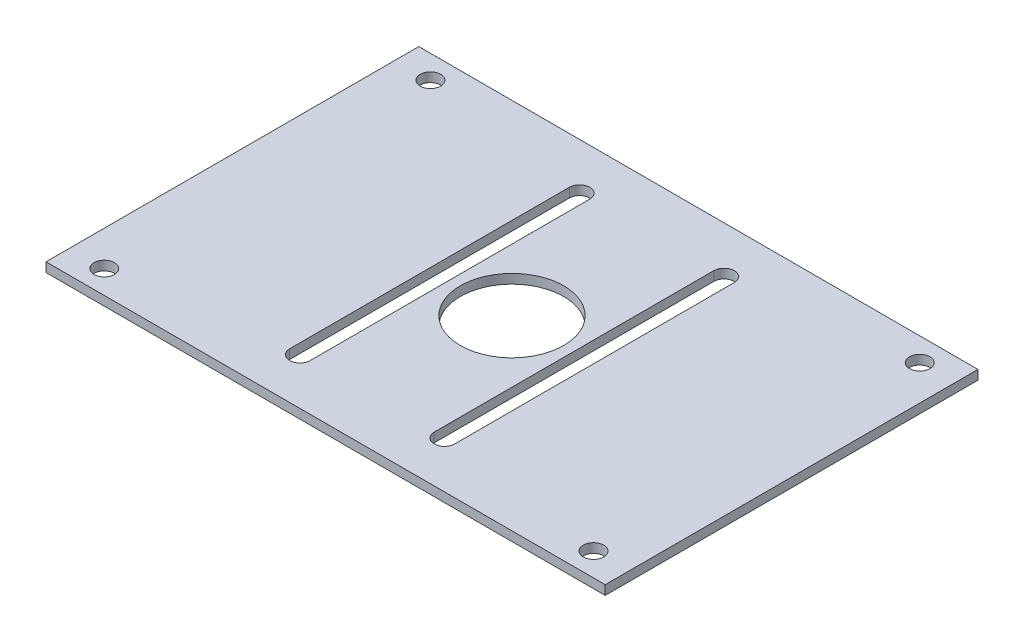
ISO-10303-21;
HEADER;
FILE_DESCRIPTION(('STEP AP214'),'2;1');
FILE_NAME('part.step','',(''),(''),'','','');
FILE_SCHEMA(('AUTOMOTIVE_DESIGN { 1 0 10303 214 1 1 1 1 }'));
ENDSEC;
DATA;
#1=APPLICATION_CONTEXT('core data for automotive mechanical design processes');
#2=APPLICATION_PROTOCOL_DEFINITION('international standard','automotive_design',2000,#1);
#3=PRODUCT_CONTEXT('',#1,'mechanical');
#4=PRODUCT('Part','Part','',(#3));
#5=PRODUCT_RELATED_PRODUCT_CATEGORY('part','',(#4));
#6=PRODUCT_DEFINITION_FORMATION('','',#4);
#7=PRODUCT_DEFINITION_CONTEXT('part definition',#1,'design');
#8=PRODUCT_DEFINITION('design','',#6,#7);
#9=PRODUCT_DEFINITION_SHAPE('','',#8);
#10=(LENGTH_UNIT() NAMED_UNIT(*) SI_UNIT(.MILLI.,.METRE.));
#11=(NAMED_UNIT(*) PLANE_ANGLE_UNIT() SI_UNIT($,.RADIAN.));
#12=(NAMED_UNIT(*) SI_UNIT($,.STERADIAN.) SOLID_ANGLE_UNIT());
#13=UNCERTAINTY_MEASURE_WITH_UNIT(LENGTH_MEASURE(1.E-05),#10,'distance_accuracy_value','');
#14=(GEOMETRIC_REPRESENTATION_CONTEXT(3) GLOBAL_UNCERTAINTY_ASSIGNED_CONTEXT((#13)) GLOBAL_UNIT_ASSIGNED_CONTEXT((#10,
#11,#12)) REPRESENTATION_CONTEXT('',''));
#15=CARTESIAN_POINT('',(0.,0.,0.));
#16=DIRECTION('',(0.,0.,1.));
#17=DIRECTION('',(1.,0.,0.));
#18=AXIS2_PLACEMENT_3D('',#15,#16,#17);
#19=CARTESIAN_POINT('',(0.,2.,0.));
#20=DIRECTION('',(0.,1.,0.));
#21=DIRECTION('',(0.,0.,1.));
#22=AXIS2_PLACEMENT_3D('',#19,#20,#21);
#23=PLANE('',#22);
#24=CARTESIAN_POINT('',(-52.5,2.,35.));
#25=DIRECTION('',(0.,1.,0.));
#26=DIRECTION('',(0.,0.,-1.));
#27=AXIS2_PLACEMENT_3D('',#24,#25,#26);
#28=CIRCLE('',#27,2.2);
#29=CARTESIAN_POINT('',(-52.5,2.,32.8));
#30=VERTEX_POINT('',#29);
#31=EDGE_CURVE('E195',#30,#30,#28,.T.);
#32=ORIENTED_EDGE('',*,*,#31,.F.);
#33=EDGE_LOOP('',(#32));
#34=FACE_BOUND('',#33,.T.);
#35=CARTESIAN_POINT('',(52.5,2.,-35.));
#36=DIRECTION('',(0.,1.,0.));
#37=DIRECTION('',(0.,0.,-1.));
#38=AXIS2_PLACEMENT_3D('',#35,#36,#37);
#39=CIRCLE('',#38,2.2);
#40=CARTESIAN_POINT('',(52.5,2.,-37.2));
#41=VERTEX_POINT('',#40);
#42=EDGE_CURVE('E207',#41,#41,#39,.T.);
#43=ORIENTED_EDGE('',*,*,#42,.F.);
#44=EDGE_LOOP('',(#43));
#45=FACE_BOUND('',#44,.T.);
#46=DIRECTION('',(0.,0.,-1.));
#47=VECTOR('',#46,1.);
#48=CARTESIAN_POINT('',(60.,2.,-40.));
#49=LINE('',#48,#47);
#50=CARTESIAN_POINT('',(60.,2.,40.));
#51=VERTEX_POINT('',#50);
#52=CARTESIAN_POINT('',(60.,2.,-40.));
#53=VERTEX_POINT('',#52);
#54=EDGE_CURVE('E219',#51,#53,#49,.T.);
#55=ORIENTED_EDGE('',*,*,#54,.T.);
#56=DIRECTION('',(-1.,0.,0.));
#57=VECTOR('',#56,1.);
#58=CARTESIAN_POINT('',(-60.,2.,-40.));
#59=LINE('',#58,#57);
#60=CARTESIAN_POINT('',(-60.,2.,-40.));
#61=VERTEX_POINT('',#60);
#62=EDGE_CURVE('E222',#53,#61,#59,.T.);
#63=ORIENTED_EDGE('',*,*,#62,.T.);
#64=DIRECTION('',(0.,0.,1.));
#65=VECTOR('',#64,1.);
#66=CARTESIAN_POINT('',(-60.,2.,-40.));
#67=LINE('',#66,#65);
#68=CARTESIAN_POINT('',(-60.,2.,40.));
#69=VERTEX_POINT('',#68);
#70=EDGE_CURVE('E225',#61,#69,#67,.T.);
#71=ORIENTED_EDGE('',*,*,#70,.T.);
#72=DIRECTION('',(1.,0.,0.));
#73=VECTOR('',#72,1.);
#74=CARTESIAN_POINT('',(-60.,2.,40.));
#75=LINE('',#74,#73);
#76=EDGE_CURVE('E227',#69,#51,#75,.T.);
#77=ORIENTED_EDGE('',*,*,#76,.T.);
#78=EDGE_LOOP('',(#55,#63,#71,#77));
#79=FACE_BOUND('',#78,.T.);
#80=CARTESIAN_POINT('',(-52.5,2.,-35.));
#81=DIRECTION('',(0.,1.,0.));
#82=DIRECTION('',(0.,0.,1.));
#83=AXIS2_PLACEMENT_3D('',#80,#81,#82);
#84=CIRCLE('',#83,2.2);
#85=CARTESIAN_POINT('',(-52.5,2.,-32.8));
#86=VERTEX_POINT('',#85);
#87=EDGE_CURVE('E213',#86,#86,#84,.T.);
#88=ORIENTED_EDGE('',*,*,#87,.F.);
#89=EDGE_LOOP('',(#88));
#90=FACE_BOUND('',#89,.T.);
#91=CARTESIAN_POINT('',(52.5,2.,35.));
#92=DIRECTION('',(0.,1.,0.));
#93=DIRECTION('',(0.,0.,1.));
#94=AXIS2_PLACEMENT_3D('',#91,#92,#93);
#95=CIRCLE('',#94,2.2);
#96=CARTESIAN_POINT('',(52.5,2.,37.2));
#97=VERTEX_POINT('',#96);
#98=EDGE_CURVE('E201',#97,#97,#95,.T.);
#99=ORIENTED_EDGE('',*,*,#98,.F.);
#100=EDGE_LOOP('',(#99));
#101=FACE_BOUND('',#100,.T.);
#102=CARTESIAN_POINT('',(0.,2.,0.));
#103=DIRECTION('',(0.,1.,0.));
#104=DIRECTION('',(0.,0.,1.));
#105=AXIS2_PLACEMENT_3D('',#102,#103,#104);
#106=CIRCLE('',#105,11.1);
#107=CARTESIAN_POINT('',(0.,2.,11.1));
#108=VERTEX_POINT('',#107);
#109=EDGE_CURVE('E189',#108,#108,#106,.T.);
#110=ORIENTED_EDGE('',*,*,#109,.F.);
#111=EDGE_LOOP('',(#110));
#112=FACE_BOUND('',#111,.T.);
#113=DIRECTION('',(0.,0.,-1.));
#114=VECTOR('',#113,1.);
#115=CARTESIAN_POINT('',(-13.3,2.,-30.));
#116=LINE('',#115,#114);
#117=CARTESIAN_POINT('',(-13.3,2.,30.));
#118=VERTEX_POINT('',#117);
#119=CARTESIAN_POINT('',(-13.3,2.,-30.));
#120=VERTEX_POINT('',#119);
#121=EDGE_CURVE('E160',#118,#120,#116,.T.);
#122=ORIENTED_EDGE('',*,*,#121,.F.);
#123=CARTESIAN_POINT('',(-15.5,2.,30.));
#124=DIRECTION('',(0.,1.,0.));
#125=DIRECTION('',(0.,0.,-1.));
#126=AXIS2_PLACEMENT_3D('',#123,#124,#125);
#127=CIRCLE('',#126,2.2);
#128=CARTESIAN_POINT('',(-17.7,2.,30.));
#129=VERTEX_POINT('',#128);
#130=EDGE_CURVE('E158',#129,#118,#127,.T.);
#131=ORIENTED_EDGE('',*,*,#130,.F.);
#132=DIRECTION('',(0.,0.,1.));
#133=VECTOR('',#132,1.);
#134=CARTESIAN_POINT('',(-17.7,2.,30.));
#135=LINE('',#134,#133);
#136=CARTESIAN_POINT('',(-17.7,2.,-30.));
#137=VERTEX_POINT('',#136);
#138=EDGE_CURVE('E166',#137,#129,#135,.T.);
#139=ORIENTED_EDGE('',*,*,#138,.F.);
#140=CARTESIAN_POINT('',(-15.5,2.,-30.));
#141=DIRECTION('',(0.,1.,0.));
#142=DIRECTION('',(0.,0.,1.));
#143=AXIS2_PLACEMENT_3D('',#140,#141,#142);
#144=CIRCLE('',#143,2.2);
#145=EDGE_CURVE('E163',#120,#137,#144,.T.);
#146=ORIENTED_EDGE('',*,*,#145,.F.);
#147=EDGE_LOOP('',(#122,#131,#139,#146));
#148=FACE_BOUND('',#147,.T.);
#149=DIRECTION('',(0.,0.,1.));
#150=VECTOR('',#149,1.);
#151=CARTESIAN_POINT('',(13.3,2.,-30.));
#152=LINE('',#151,#150);
#153=CARTESIAN_POINT('',(13.3,2.,-30.));
#154=VERTEX_POINT('',#153);
#155=CARTESIAN_POINT('',(13.3,2.,30.));
#156=VERTEX_POINT('',#155);
#157=EDGE_CURVE('E130',#154,#156,#152,.T.);
#158=ORIENTED_EDGE('',*,*,#157,.F.);
#159=CARTESIAN_POINT('',(15.5,2.,-30.));
#160=DIRECTION('',(0.,1.,0.));
#161=DIRECTION('',(0.,0.,-1.));
#162=AXIS2_PLACEMENT_3D('',#159,#160,#161);
#163=CIRCLE('',#162,2.2);
#164=CARTESIAN_POINT('',(17.7,2.,-30.));
#165=VERTEX_POINT('',#164);
#166=EDGE_CURVE('E122',#165,#154,#163,.T.);
#167=ORIENTED_EDGE('',*,*,#166,.F.);
#168=DIRECTION('',(0.,0.,-1.));
#169=VECTOR('',#168,1.);
#170=CARTESIAN_POINT('',(17.7,2.,30.));
#171=LINE('',#170,#169);
#172=CARTESIAN_POINT('',(17.7,2.,30.));
#173=VERTEX_POINT('',#172);
#174=EDGE_CURVE('E144',#173,#165,#171,.T.);
#175=ORIENTED_EDGE('',*,*,#174,.F.);
#176=CARTESIAN_POINT('',(15.5,2.,30.));
#177=DIRECTION('',(0.,1.,0.));
#178=DIRECTION('',(0.,0.,1.));
#179=AXIS2_PLACEMENT_3D('',#176,#177,#178);
#180=CIRCLE('',#179,2.2);
#181=EDGE_CURVE('E142',#156,#173,#180,.T.);
#182=ORIENTED_EDGE('',*,*,#181,.F.);
#183=EDGE_LOOP('',(#158,#167,#175,#182));
#184=FACE_BOUND('',#183,.T.);
#185=ADVANCED_FACE('F33',(#34,#45,#79,#90,#101,#112,#148,#184),#23,.T.);
#186=CARTESIAN_POINT('',(0.,0.,0.));
#187=DIRECTION('',(0.,1.,0.));
#188=DIRECTION('',(0.,0.,1.));
#189=AXIS2_PLACEMENT_3D('',#186,#187,#188);
#190=PLANE('',#189);
#191=CARTESIAN_POINT('',(-15.5,0.,30.));
#192=DIRECTION('',(0.,1.,0.));
#193=DIRECTION('',(0.,0.,-1.));
#194=AXIS2_PLACEMENT_3D('',#191,#192,#193);
#195=CIRCLE('',#194,2.2);
#196=CARTESIAN_POINT('',(-17.7,0.,30.));
#197=VERTEX_POINT('',#196);
#198=CARTESIAN_POINT('',(-13.3,0.,30.));
#199=VERTEX_POINT('',#198);
#200=EDGE_CURVE('E138',#197,#199,#195,.T.);
#201=ORIENTED_EDGE('',*,*,#200,.T.);
#202=DIRECTION('',(0.,0.,-1.));
#203=VECTOR('',#202,1.);
#204=CARTESIAN_POINT('',(-13.3,0.,-30.));
#205=LINE('',#204,#203);
#206=CARTESIAN_POINT('',(-13.3,0.,-30.));
#207=VERTEX_POINT('',#206);
#208=EDGE_CURVE('E171',#199,#207,#205,.T.);
#209=ORIENTED_EDGE('',*,*,#208,.T.);
#210=CARTESIAN_POINT('',(-15.5,0.,-30.));
#211=DIRECTION('',(0.,1.,0.));
#212=DIRECTION('',(0.,0.,1.));
#213=AXIS2_PLACEMENT_3D('',#210,#211,#212);
#214=CIRCLE('',#213,2.2);
#215=CARTESIAN_POINT('',(-17.7,0.,-30.));
#216=VERTEX_POINT('',#215);
#217=EDGE_CURVE('E174',#207,#216,#214,.T.);
#218=ORIENTED_EDGE('',*,*,#217,.T.);
#219=DIRECTION('',(0.,0.,1.));
#220=VECTOR('',#219,1.);
#221=CARTESIAN_POINT('',(-17.7,0.,30.));
#222=LINE('',#221,#220);
#223=EDGE_CURVE('E161',#216,#197,#222,.T.);
#224=ORIENTED_EDGE('',*,*,#223,.T.);
#225=EDGE_LOOP('',(#201,#209,#218,#224));
#226=FACE_BOUND('',#225,.T.);
#227=DIRECTION('',(0.,0.,-1.));
#228=VECTOR('',#227,1.);
#229=CARTESIAN_POINT('',(60.,0.,-40.));
#230=LINE('',#229,#228);
#231=CARTESIAN_POINT('',(60.,0.,40.));
#232=VERTEX_POINT('',#231);
#233=CARTESIAN_POINT('',(60.,0.,-40.));
#234=VERTEX_POINT('',#233);
#235=EDGE_CURVE('E216',#232,#234,#230,.T.);
#236=ORIENTED_EDGE('',*,*,#235,.F.);
#237=DIRECTION('',(1.,0.,0.));
#238=VECTOR('',#237,1.);
#239=CARTESIAN_POINT('',(-60.,0.,40.));
#240=LINE('',#239,#238);
#241=CARTESIAN_POINT('',(-60.,0.,40.));
#242=VERTEX_POINT('',#241);
#243=EDGE_CURVE('E223',#242,#232,#240,.T.);
#244=ORIENTED_EDGE('',*,*,#243,.F.);
#245=DIRECTION('',(0.,0.,1.));
#246=VECTOR('',#245,1.);
#247=CARTESIAN_POINT('',(-60.,0.,-40.));
#248=LINE('',#247,#246);
#249=CARTESIAN_POINT('',(-60.,0.,-40.));
#250=VERTEX_POINT('',#249);
#251=EDGE_CURVE('E234',#250,#242,#248,.T.);
#252=ORIENTED_EDGE('',*,*,#251,.F.);
#253=DIRECTION('',(-1.,0.,0.));
#254=VECTOR('',#253,1.);
#255=CARTESIAN_POINT('',(-60.,0.,-40.));
#256=LINE('',#255,#254);
#257=EDGE_CURVE('E232',#234,#250,#256,.T.);
#258=ORIENTED_EDGE('',*,*,#257,.F.);
#259=EDGE_LOOP('',(#236,#244,#252,#258));
#260=FACE_BOUND('',#259,.T.);
#261=CARTESIAN_POINT('',(-52.5,0.,-35.));
#262=DIRECTION('',(0.,1.,0.));
#263=DIRECTION('',(0.,0.,1.));
#264=AXIS2_PLACEMENT_3D('',#261,#262,#263);
#265=CIRCLE('',#264,2.2);
#266=CARTESIAN_POINT('',(-52.5,0.,-32.8));
#267=VERTEX_POINT('',#266);
#268=EDGE_CURVE('E210',#267,#267,#265,.T.);
#269=ORIENTED_EDGE('',*,*,#268,.T.);
#270=EDGE_LOOP('',(#269));
#271=FACE_BOUND('',#270,.T.);
#272=CARTESIAN_POINT('',(52.5,0.,-35.));
#273=DIRECTION('',(0.,1.,0.));
#274=DIRECTION('',(0.,0.,-1.));
#275=AXIS2_PLACEMENT_3D('',#272,#273,#274);
#276=CIRCLE('',#275,2.2);
#277=CARTESIAN_POINT('',(52.5,0.,-37.2));
#278=VERTEX_POINT('',#277);
#279=EDGE_CURVE('E204',#278,#278,#276,.T.);
#280=ORIENTED_EDGE('',*,*,#279,.T.);
#281=EDGE_LOOP('',(#280));
#282=FACE_BOUND('',#281,.T.);
#283=CARTESIAN_POINT('',(52.5,0.,35.));
#284=DIRECTION('',(0.,1.,0.));
#285=DIRECTION('',(0.,0.,1.));
#286=AXIS2_PLACEMENT_3D('',#283,#284,#285);
#287=CIRCLE('',#286,2.2);
#288=CARTESIAN_POINT('',(52.5,0.,37.2));
#289=VERTEX_POINT('',#288);
#290=EDGE_CURVE('E198',#289,#289,#287,.T.);
#291=ORIENTED_EDGE('',*,*,#290,.T.);
#292=EDGE_LOOP('',(#291));
#293=FACE_BOUND('',#292,.T.);
#294=CARTESIAN_POINT('',(-52.5,0.,35.));
#295=DIRECTION('',(0.,1.,0.));
#296=DIRECTION('',(0.,0.,-1.));
#297=AXIS2_PLACEMENT_3D('',#294,#295,#296);
#298=CIRCLE('',#297,2.2);
#299=CARTESIAN_POINT('',(-52.5,0.,32.8));
#300=VERTEX_POINT('',#299);
#301=EDGE_CURVE('E192',#300,#300,#298,.T.);
#302=ORIENTED_EDGE('',*,*,#301,.T.);
#303=EDGE_LOOP('',(#302));
#304=FACE_BOUND('',#303,.T.);
#305=CARTESIAN_POINT('',(0.,0.,0.));
#306=DIRECTION('',(0.,1.,0.));
#307=DIRECTION('',(0.,0.,1.));
#308=AXIS2_PLACEMENT_3D('',#305,#306,#307);
#309=CIRCLE('',#308,11.1);
#310=CARTESIAN_POINT('',(0.,0.,11.1));
#311=VERTEX_POINT('',#310);
#312=EDGE_CURVE('E188',#311,#311,#309,.T.);
#313=ORIENTED_EDGE('',*,*,#312,.T.);
#314=EDGE_LOOP('',(#313));
#315=FACE_BOUND('',#314,.T.);
#316=CARTESIAN_POINT('',(15.5,0.,-30.));
#317=DIRECTION('',(0.,1.,0.));
#318=DIRECTION('',(0.,0.,-1.));
#319=AXIS2_PLACEMENT_3D('',#316,#317,#318);
#320=CIRCLE('',#319,2.2);
#321=CARTESIAN_POINT('',(17.7,0.,-30.));
#322=VERTEX_POINT('',#321);
#323=CARTESIAN_POINT('',(13.3,0.,-30.));
#324=VERTEX_POINT('',#323);
#325=EDGE_CURVE('E56',#322,#324,#320,.T.);
#326=ORIENTED_EDGE('',*,*,#325,.T.);
#327=DIRECTION('',(0.,0.,1.));
#328=VECTOR('',#327,1.);
#329=CARTESIAN_POINT('',(13.3,0.,-30.));
#330=LINE('',#329,#328);
#331=CARTESIAN_POINT('',(13.3,0.,30.));
#332=VERTEX_POINT('',#331);
#333=EDGE_CURVE('E137',#324,#332,#330,.T.);
#334=ORIENTED_EDGE('',*,*,#333,.T.);
#335=CARTESIAN_POINT('',(15.5,0.,30.));
#336=DIRECTION('',(0.,1.,0.));
#337=DIRECTION('',(0.,0.,1.));
#338=AXIS2_PLACEMENT_3D('',#335,#336,#337);
#339=CIRCLE('',#338,2.2);
#340=CARTESIAN_POINT('',(17.7,0.,30.));
#341=VERTEX_POINT('',#340);
#342=EDGE_CURVE('E150',#332,#341,#339,.T.);
#343=ORIENTED_EDGE('',*,*,#342,.T.);
#344=DIRECTION('',(0.,0.,-1.));
#345=VECTOR('',#344,1.);
#346=CARTESIAN_POINT('',(17.7,0.,30.));
#347=LINE('',#346,#345);
#348=EDGE_CURVE('E131',#341,#322,#347,.T.);
#349=ORIENTED_EDGE('',*,*,#348,.T.);
#350=EDGE_LOOP('',(#326,#334,#343,#349));
#351=FACE_BOUND('',#350,.T.);
#352=ADVANCED_FACE('F252',(#226,#260,#271,#282,#293,#304,#315,#351),#190,.F.);
#353=CARTESIAN_POINT('',(60.,2.,-40.));
#354=DIRECTION('',(-1.,0.,0.));
#355=DIRECTION('',(0.,0.,1.));
#356=AXIS2_PLACEMENT_3D('',#353,#354,#355);
#357=PLANE('',#356);
#358=ORIENTED_EDGE('',*,*,#235,.T.);
#359=DIRECTION('',(0.,-1.,0.));
#360=VECTOR('',#359,1.);
#361=CARTESIAN_POINT('',(60.,2.,-40.));
#362=LINE('',#361,#360);
#363=EDGE_CURVE('E11',#53,#234,#362,.T.);
#364=ORIENTED_EDGE('',*,*,#363,.F.);
#365=ORIENTED_EDGE('',*,*,#54,.F.);
#366=DIRECTION('',(0.,-1.,0.));
#367=VECTOR('',#366,1.);
#368=CARTESIAN_POINT('',(60.,2.,40.));
#369=LINE('',#368,#367);
#370=EDGE_CURVE('E229',#51,#232,#369,.T.);
#371=ORIENTED_EDGE('',*,*,#370,.T.);
#372=EDGE_LOOP('',(#358,#364,#365,#371));
#373=FACE_BOUND('',#372,.T.);
#374=ADVANCED_FACE('F35',(#373),#357,.F.);
#375=CARTESIAN_POINT('',(-60.,2.,-40.));
#376=DIRECTION('',(0.,0.,1.));
#377=DIRECTION('',(1.,0.,0.));
#378=AXIS2_PLACEMENT_3D('',#375,#376,#377);
#379=PLANE('',#378);
#380=ORIENTED_EDGE('',*,*,#257,.T.);
#381=DIRECTION('',(0.,-1.,0.));
#382=VECTOR('',#381,1.);
#383=CARTESIAN_POINT('',(-60.,2.,-40.));
#384=LINE('',#383,#382);
#385=EDGE_CURVE('E41',#61,#250,#384,.T.);
#386=ORIENTED_EDGE('',*,*,#385,.F.);
#387=ORIENTED_EDGE('',*,*,#62,.F.);
#388=ORIENTED_EDGE('',*,*,#363,.T.);
#389=EDGE_LOOP('',(#380,#386,#387,#388));
#390=FACE_BOUND('',#389,.T.);
#391=ADVANCED_FACE('F263',(#390),#379,.F.);
#392=CARTESIAN_POINT('',(-60.,2.,-40.));
#393=DIRECTION('',(1.,0.,0.));
#394=DIRECTION('',(0.,0.,-1.));
#395=AXIS2_PLACEMENT_3D('',#392,#393,#394);
#396=PLANE('',#395);
#397=ORIENTED_EDGE('',*,*,#251,.T.);
#398=DIRECTION('',(0.,-1.,0.));
#399=VECTOR('',#398,1.);
#400=CARTESIAN_POINT('',(-60.,2.,40.));
#401=LINE('',#400,#399);
#402=EDGE_CURVE('E239',#69,#242,#401,.T.);
#403=ORIENTED_EDGE('',*,*,#402,.F.);
#404=ORIENTED_EDGE('',*,*,#70,.F.);
#405=ORIENTED_EDGE('',*,*,#385,.T.);
#406=EDGE_LOOP('',(#397,#403,#404,#405));
#407=FACE_BOUND('',#406,.T.);
#408=ADVANCED_FACE('F246',(#407),#396,.F.);
#409=CARTESIAN_POINT('',(-60.,2.,40.));
#410=DIRECTION('',(0.,0.,-1.));
#411=DIRECTION('',(-1.,0.,0.));
#412=AXIS2_PLACEMENT_3D('',#409,#410,#411);
#413=PLANE('',#412);
#414=ORIENTED_EDGE('',*,*,#243,.T.);
#415=ORIENTED_EDGE('',*,*,#370,.F.);
#416=ORIENTED_EDGE('',*,*,#76,.F.);
#417=ORIENTED_EDGE('',*,*,#402,.T.);
#418=EDGE_LOOP('',(#414,#415,#416,#417));
#419=FACE_BOUND('',#418,.T.);
#420=ADVANCED_FACE('F256',(#419),#413,.F.);
#421=CARTESIAN_POINT('',(-52.5,2.,-35.));
#422=DIRECTION('',(0.,-1.,0.));
#423=DIRECTION('',(0.,0.,-1.));
#424=AXIS2_PLACEMENT_3D('',#421,#422,#423);
#425=CYLINDRICAL_SURFACE('',#424,2.2);
#426=ORIENTED_EDGE('',*,*,#87,.T.);
#427=EDGE_LOOP('',(#426));
#428=FACE_BOUND('',#427,.T.);
#429=ORIENTED_EDGE('',*,*,#268,.F.);
#430=EDGE_LOOP('',(#429));
#431=FACE_BOUND('',#430,.T.);
#432=ADVANCED_FACE('F281',(#428,#431),#425,.F.);
#433=CARTESIAN_POINT('',(52.5,2.,-35.));
#434=DIRECTION('',(0.,-1.,0.));
#435=DIRECTION('',(0.,0.,-1.));
#436=AXIS2_PLACEMENT_3D('',#433,#434,#435);
#437=CYLINDRICAL_SURFACE('',#436,2.2);
#438=ORIENTED_EDGE('',*,*,#42,.T.);
#439=EDGE_LOOP('',(#438));
#440=FACE_BOUND('',#439,.T.);
#441=ORIENTED_EDGE('',*,*,#279,.F.);
#442=EDGE_LOOP('',(#441));
#443=FACE_BOUND('',#442,.T.);
#444=ADVANCED_FACE('F288',(#440,#443),#437,.F.);
#445=CARTESIAN_POINT('',(52.5,2.,35.));
#446=DIRECTION('',(0.,-1.,0.));
#447=DIRECTION('',(0.,0.,-1.));
#448=AXIS2_PLACEMENT_3D('',#445,#446,#447);
#449=CYLINDRICAL_SURFACE('',#448,2.2);
#450=ORIENTED_EDGE('',*,*,#98,.T.);
#451=EDGE_LOOP('',(#450));
#452=FACE_BOUND('',#451,.T.);
#453=ORIENTED_EDGE('',*,*,#290,.F.);
#454=EDGE_LOOP('',(#453));
#455=FACE_BOUND('',#454,.T.);
#456=ADVANCED_FACE('F293',(#452,#455),#449,.F.);
#457=CARTESIAN_POINT('',(-52.5,2.,35.));
#458=DIRECTION('',(0.,-1.,0.));
#459=DIRECTION('',(0.,0.,-1.));
#460=AXIS2_PLACEMENT_3D('',#457,#458,#459);
#461=CYLINDRICAL_SURFACE('',#460,2.2);
#462=ORIENTED_EDGE('',*,*,#31,.T.);
#463=EDGE_LOOP('',(#462));
#464=FACE_BOUND('',#463,.T.);
#465=ORIENTED_EDGE('',*,*,#301,.F.);
#466=EDGE_LOOP('',(#465));
#467=FACE_BOUND('',#466,.T.);
#468=ADVANCED_FACE('F341',(#464,#467),#461,.F.);
#469=CARTESIAN_POINT('',(0.,2.,0.));
#470=DIRECTION('',(0.,-1.,0.));
#471=DIRECTION('',(0.,0.,-1.));
#472=AXIS2_PLACEMENT_3D('',#469,#470,#471);
#473=CYLINDRICAL_SURFACE('',#472,11.1);
#474=ORIENTED_EDGE('',*,*,#109,.T.);
#475=EDGE_LOOP('',(#474));
#476=FACE_BOUND('',#475,.T.);
#477=ORIENTED_EDGE('',*,*,#312,.F.);
#478=EDGE_LOOP('',(#477));
#479=FACE_BOUND('',#478,.T.);
#480=ADVANCED_FACE('F337',(#476,#479),#473,.F.);
#481=CARTESIAN_POINT('',(-15.5,2.,30.));
#482=DIRECTION('',(0.,-1.,0.));
#483=DIRECTION('',(0.,0.,-1.));
#484=AXIS2_PLACEMENT_3D('',#481,#482,#483);
#485=CYLINDRICAL_SURFACE('',#484,2.2);
#486=ORIENTED_EDGE('',*,*,#200,.F.);
#487=DIRECTION('',(0.,-1.,0.));
#488=VECTOR('',#487,1.);
#489=CARTESIAN_POINT('',(-17.7,2.,30.));
#490=LINE('',#489,#488);
#491=EDGE_CURVE('E168',#129,#197,#490,.T.);
#492=ORIENTED_EDGE('',*,*,#491,.F.);
#493=ORIENTED_EDGE('',*,*,#130,.T.);
#494=DIRECTION('',(0.,-1.,0.));
#495=VECTOR('',#494,1.);
#496=CARTESIAN_POINT('',(-13.3,2.,30.));
#497=LINE('',#496,#495);
#498=EDGE_CURVE('E185',#118,#199,#497,.T.);
#499=ORIENTED_EDGE('',*,*,#498,.T.);
#500=EDGE_LOOP('',(#486,#492,#493,#499));
#501=FACE_BOUND('',#500,.T.);
#502=ADVANCED_FACE('F333',(#501),#485,.F.);
#503=CARTESIAN_POINT('',(-13.3,2.,-30.));
#504=DIRECTION('',(-1.,0.,0.));
#505=DIRECTION('',(0.,0.,1.));
#506=AXIS2_PLACEMENT_3D('',#503,#504,#505);
#507=PLANE('',#506);
#508=ORIENTED_EDGE('',*,*,#208,.F.);
#509=ORIENTED_EDGE('',*,*,#498,.F.);
#510=ORIENTED_EDGE('',*,*,#121,.T.);
#511=DIRECTION('',(0.,-1.,0.));
#512=VECTOR('',#511,1.);
#513=CARTESIAN_POINT('',(-13.3,2.,-30.));
#514=LINE('',#513,#512);
#515=EDGE_CURVE('E183',#120,#207,#514,.T.);
#516=ORIENTED_EDGE('',*,*,#515,.T.);
#517=EDGE_LOOP('',(#508,#509,#510,#516));
#518=FACE_BOUND('',#517,.T.);
#519=ADVANCED_FACE('F329',(#518),#507,.T.);
#520=CARTESIAN_POINT('',(-15.5,2.,-30.));
#521=DIRECTION('',(0.,-1.,0.));
#522=DIRECTION('',(0.,0.,-1.));
#523=AXIS2_PLACEMENT_3D('',#520,#521,#522);
#524=CYLINDRICAL_SURFACE('',#523,2.2);
#525=ORIENTED_EDGE('',*,*,#217,.F.);
#526=ORIENTED_EDGE('',*,*,#515,.F.);
#527=ORIENTED_EDGE('',*,*,#145,.T.);
#528=DIRECTION('',(0.,-1.,0.));
#529=VECTOR('',#528,1.);
#530=CARTESIAN_POINT('',(-17.7,2.,-30.));
#531=LINE('',#530,#529);
#532=EDGE_CURVE('E181',#137,#216,#531,.T.);
#533=ORIENTED_EDGE('',*,*,#532,.T.);
#534=EDGE_LOOP('',(#525,#526,#527,#533));
#535=FACE_BOUND('',#534,.T.);
#536=ADVANCED_FACE('F325',(#535),#524,.F.);
#537=CARTESIAN_POINT('',(-17.7,2.,30.));
#538=DIRECTION('',(1.,0.,0.));
#539=DIRECTION('',(0.,0.,-1.));
#540=AXIS2_PLACEMENT_3D('',#537,#538,#539);
#541=PLANE('',#540);
#542=ORIENTED_EDGE('',*,*,#223,.F.);
#543=ORIENTED_EDGE('',*,*,#532,.F.);
#544=ORIENTED_EDGE('',*,*,#138,.T.);
#545=ORIENTED_EDGE('',*,*,#491,.T.);
#546=EDGE_LOOP('',(#542,#543,#544,#545));
#547=FACE_BOUND('',#546,.T.);
#548=ADVANCED_FACE('F322',(#547),#541,.T.);
#549=CARTESIAN_POINT('',(15.5,2.,-30.));
#550=DIRECTION('',(0.,-1.,0.));
#551=DIRECTION('',(0.,0.,-1.));
#552=AXIS2_PLACEMENT_3D('',#549,#550,#551);
#553=CYLINDRICAL_SURFACE('',#552,2.2);
#554=ORIENTED_EDGE('',*,*,#325,.F.);
#555=DIRECTION('',(0.,-1.,0.));
#556=VECTOR('',#555,1.);
#557=CARTESIAN_POINT('',(17.7,2.,-30.));
#558=LINE('',#557,#556);
#559=EDGE_CURVE('E126',#165,#322,#558,.T.);
#560=ORIENTED_EDGE('',*,*,#559,.F.);
#561=ORIENTED_EDGE('',*,*,#166,.T.);
#562=DIRECTION('',(0.,-1.,0.));
#563=VECTOR('',#562,1.);
#564=CARTESIAN_POINT('',(13.3,2.,-30.));
#565=LINE('',#564,#563);
#566=EDGE_CURVE('E125',#154,#324,#565,.T.);
#567=ORIENTED_EDGE('',*,*,#566,.T.);
#568=EDGE_LOOP('',(#554,#560,#561,#567));
#569=FACE_BOUND('',#568,.T.);
#570=ADVANCED_FACE('F124',(#569),#553,.F.);
#571=CARTESIAN_POINT('',(13.3,2.,-30.));
#572=DIRECTION('',(1.,0.,0.));
#573=DIRECTION('',(0.,0.,-1.));
#574=AXIS2_PLACEMENT_3D('',#571,#572,#573);
#575=PLANE('',#574);
#576=ORIENTED_EDGE('',*,*,#333,.F.);
#577=ORIENTED_EDGE('',*,*,#566,.F.);
#578=ORIENTED_EDGE('',*,*,#157,.T.);
#579=DIRECTION('',(0.,-1.,0.));
#580=VECTOR('',#579,1.);
#581=CARTESIAN_POINT('',(13.3,2.,30.));
#582=LINE('',#581,#580);
#583=EDGE_CURVE('E139',#156,#332,#582,.T.);
#584=ORIENTED_EDGE('',*,*,#583,.T.);
#585=EDGE_LOOP('',(#576,#577,#578,#584));
#586=FACE_BOUND('',#585,.T.);
#587=ADVANCED_FACE('F134',(#586),#575,.T.);
#588=CARTESIAN_POINT('',(15.5,2.,30.));
#589=DIRECTION('',(0.,-1.,0.));
#590=DIRECTION('',(0.,0.,-1.));
#591=AXIS2_PLACEMENT_3D('',#588,#589,#590);
#592=CYLINDRICAL_SURFACE('',#591,2.2);
#593=ORIENTED_EDGE('',*,*,#342,.F.);
#594=ORIENTED_EDGE('',*,*,#583,.F.);
#595=ORIENTED_EDGE('',*,*,#181,.T.);
#596=DIRECTION('',(0.,-1.,0.));
#597=VECTOR('',#596,1.);
#598=CARTESIAN_POINT('',(17.7,2.,30.));
#599=LINE('',#598,#597);
#600=EDGE_CURVE('E48',#173,#341,#599,.T.);
#601=ORIENTED_EDGE('',*,*,#600,.T.);
#602=EDGE_LOOP('',(#593,#594,#595,#601));
#603=FACE_BOUND('',#602,.T.);
#604=ADVANCED_FACE('F310',(#603),#592,.F.);
#605=CARTESIAN_POINT('',(17.7,2.,30.));
#606=DIRECTION('',(-1.,0.,0.));
#607=DIRECTION('',(0.,0.,1.));
#608=AXIS2_PLACEMENT_3D('',#605,#606,#607);
#609=PLANE('',#608);
#610=ORIENTED_EDGE('',*,*,#348,.F.);
#611=ORIENTED_EDGE('',*,*,#600,.F.);
#612=ORIENTED_EDGE('',*,*,#174,.T.);
#613=ORIENTED_EDGE('',*,*,#559,.T.);
#614=EDGE_LOOP('',(#610,#611,#612,#613));
#615=FACE_BOUND('',#614,.T.);
#616=ADVANCED_FACE('F308',(#615),#609,.T.);
#617=CLOSED_SHELL('',(#185,#352,#374,#391,#408,#420,#432,#444,#456,#468,#480,#502,#519,#536,
#548,#570,#587,#604,#616));
#618=MANIFOLD_SOLID_BREP('B2',#617);
#619=ADVANCED_BREP_SHAPE_REPRESENTATION('',(#18,#618),#14);
#620=SHAPE_DEFINITION_REPRESENTATION(#9,#619);
ENDSEC;
END-ISO-10303-21;
